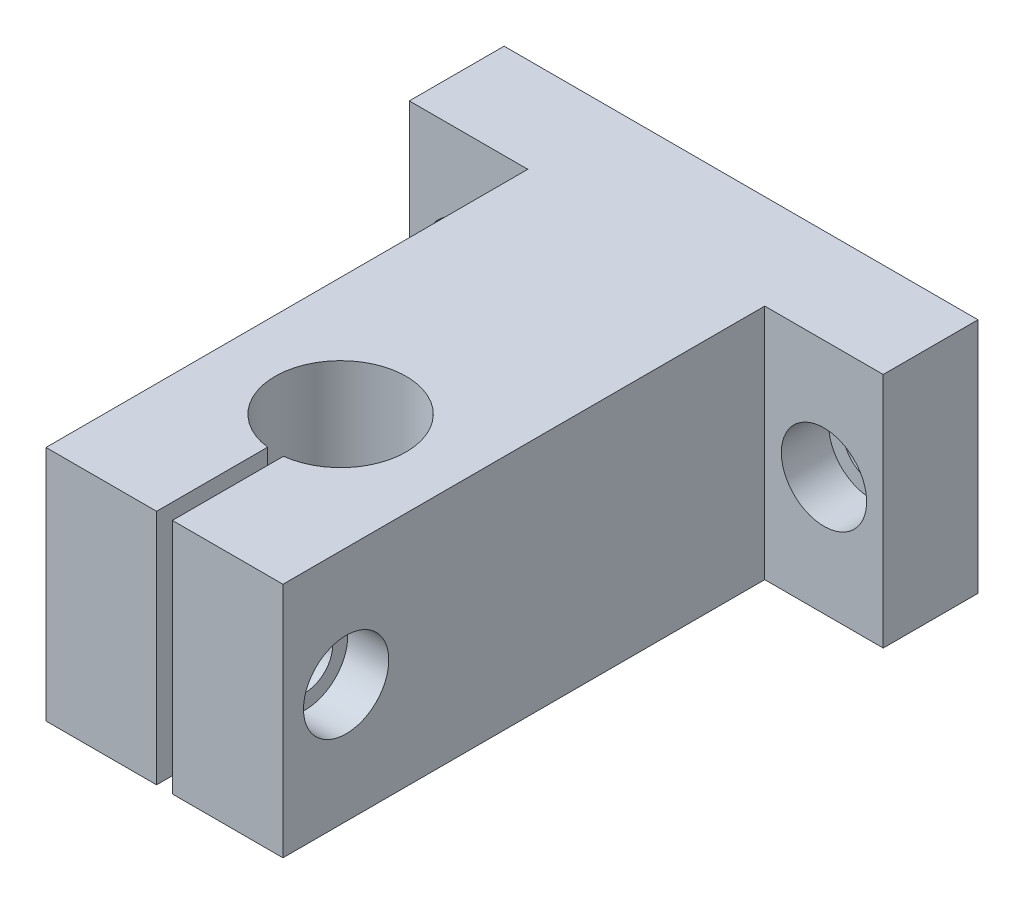
ISO-10303-21;
HEADER;
FILE_DESCRIPTION(('STEP AP214'),'2;1');
FILE_NAME('part.step','',(''),(''),'','','');
FILE_SCHEMA(('AUTOMOTIVE_DESIGN { 1 0 10303 214 1 1 1 1 }'));
ENDSEC;
DATA;
#1=APPLICATION_CONTEXT('core data for automotive mechanical design processes');
#2=APPLICATION_PROTOCOL_DEFINITION('international standard','automotive_design',2000,#1);
#3=PRODUCT_CONTEXT('',#1,'mechanical');
#4=PRODUCT('Part','Part','',(#3));
#5=PRODUCT_RELATED_PRODUCT_CATEGORY('part','',(#4));
#6=PRODUCT_DEFINITION_FORMATION('','',#4);
#7=PRODUCT_DEFINITION_CONTEXT('part definition',#1,'design');
#8=PRODUCT_DEFINITION('design','',#6,#7);
#9=PRODUCT_DEFINITION_SHAPE('','',#8);
#10=(LENGTH_UNIT() NAMED_UNIT(*) SI_UNIT(.MILLI.,.METRE.));
#11=(NAMED_UNIT(*) PLANE_ANGLE_UNIT() SI_UNIT($,.RADIAN.));
#12=(NAMED_UNIT(*) SI_UNIT($,.STERADIAN.) SOLID_ANGLE_UNIT());
#13=UNCERTAINTY_MEASURE_WITH_UNIT(LENGTH_MEASURE(1.E-05),#10,'distance_accuracy_value','');
#14=(GEOMETRIC_REPRESENTATION_CONTEXT(3) GLOBAL_UNCERTAINTY_ASSIGNED_CONTEXT((#13)) GLOBAL_UNIT_ASSIGNED_CONTEXT((#10,
#11,#12)) REPRESENTATION_CONTEXT('',''));
#15=CARTESIAN_POINT('',(0.,0.,0.));
#16=DIRECTION('',(0.,0.,1.));
#17=DIRECTION('',(1.,0.,0.));
#18=AXIS2_PLACEMENT_3D('',#15,#16,#17);
#19=CARTESIAN_POINT('',(11.25,-7.5,-60.0964096844655));
#20=DIRECTION('',(0.,0.,1.));
#21=DIRECTION('',(0.,-1.,0.));
#22=AXIS2_PLACEMENT_3D('',#19,#20,#21);
#23=CYLINDRICAL_SURFACE('',#22,1.75);
#24=CARTESIAN_POINT('',(11.25,-7.5,-16.));
#25=DIRECTION('',(0.,0.,1.));
#26=DIRECTION('',(0.,-1.,0.));
#27=AXIS2_PLACEMENT_3D('',#24,#25,#26);
#28=CIRCLE('',#27,1.75);
#29=CARTESIAN_POINT('',(11.25,-9.25,-16.));
#30=VERTEX_POINT('',#29);
#31=EDGE_CURVE('E280',#30,#30,#28,.F.);
#32=ORIENTED_EDGE('',*,*,#31,.T.);
#33=EDGE_LOOP('',(#32));
#34=FACE_BOUND('',#33,.T.);
#35=CARTESIAN_POINT('',(11.25,-7.5,-13.));
#36=DIRECTION('',(0.,0.,1.));
#37=DIRECTION('',(-1.,0.,0.));
#38=AXIS2_PLACEMENT_3D('',#35,#36,#37);
#39=CIRCLE('',#38,1.75);
#40=CARTESIAN_POINT('',(9.5,-7.5,-13.));
#41=VERTEX_POINT('',#40);
#42=EDGE_CURVE('E695',#41,#41,#39,.T.);
#43=ORIENTED_EDGE('',*,*,#42,.T.);
#44=EDGE_LOOP('',(#43));
#45=FACE_BOUND('',#44,.T.);
#46=ADVANCED_FACE('F16',(#34,#45),#23,.F.);
#47=CARTESIAN_POINT('',(-7.5,-15.,-1.09983721300845));
#48=DIRECTION('',(1.,0.,0.));
#49=DIRECTION('',(0.,1.,0.));
#50=AXIS2_PLACEMENT_3D('',#47,#48,#49);
#51=PLANE('',#50);
#52=DIRECTION('',(0.,0.,-1.));
#53=VECTOR('',#52,1.);
#54=CARTESIAN_POINT('',(-7.5,0.,-1.09983721300845));
#55=LINE('',#54,#53);
#56=CARTESIAN_POINT('',(-7.5,0.,20.5));
#57=VERTEX_POINT('',#56);
#58=CARTESIAN_POINT('',(-7.5,0.,-10.));
#59=VERTEX_POINT('',#58);
#60=EDGE_CURVE('E343',#57,#59,#55,.T.);
#61=ORIENTED_EDGE('',*,*,#60,.T.);
#62=DIRECTION('',(0.,1.,0.));
#63=VECTOR('',#62,1.);
#64=CARTESIAN_POINT('',(-7.5,-15.,-10.));
#65=LINE('',#64,#63);
#66=CARTESIAN_POINT('',(-7.5,-15.,-10.));
#67=VERTEX_POINT('',#66);
#68=EDGE_CURVE('E26',#67,#59,#65,.T.);
#69=ORIENTED_EDGE('',*,*,#68,.F.);
#70=DIRECTION('',(0.,0.,-1.));
#71=VECTOR('',#70,1.);
#72=CARTESIAN_POINT('',(-7.5,-15.,-1.09983721300845));
#73=LINE('',#72,#71);
#74=CARTESIAN_POINT('',(-7.5,-15.,20.5));
#75=VERTEX_POINT('',#74);
#76=EDGE_CURVE('E308',#75,#67,#73,.T.);
#77=ORIENTED_EDGE('',*,*,#76,.F.);
#78=DIRECTION('',(0.,1.,0.));
#79=VECTOR('',#78,1.);
#80=CARTESIAN_POINT('',(-7.5,-15.,20.5));
#81=LINE('',#80,#79);
#82=EDGE_CURVE('E10',#75,#57,#81,.T.);
#83=ORIENTED_EDGE('',*,*,#82,.T.);
#84=EDGE_LOOP('',(#61,#69,#77,#83));
#85=FACE_BOUND('',#84,.T.);
#86=DIRECTION('',(0.,-0.77557066614127,-0.631260755806336));
#87=VECTOR('',#86,1.);
#88=CARTESIAN_POINT('',(-7.5,-9.26753011625774,18.6715978651955));
#89=LINE('',#88,#87);
#90=CARTESIAN_POINT('',(-7.5,-8.01375750421547,19.6920818536178));
#91=VERTEX_POINT('',#90);
#92=CARTESIAN_POINT('',(-7.5,-10.5213027283,17.6511138767734));
#93=VERTEX_POINT('',#92);
#94=EDGE_CURVE('E193',#91,#93,#89,.T.);
#95=ORIENTED_EDGE('',*,*,#94,.T.);
#96=DIRECTION('',(0.,0.158902517869817,-0.987294277211528));
#97=VECTOR('',#96,1.);
#98=CARTESIAN_POINT('',(-7.5,-8.61714673765487,5.82019805691087));
#99=LINE('',#98,#97);
#100=CARTESIAN_POINT('',(-7.5,-10.0075452240845,14.4590320231556));
#101=VERTEX_POINT('',#100);
#102=EDGE_CURVE('E216',#93,#101,#99,.T.);
#103=ORIENTED_EDGE('',*,*,#102,.T.);
#104=DIRECTION('',(0.,0.934473184011087,-0.356033521405191));
#105=VECTOR('',#104,1.);
#106=CARTESIAN_POINT('',(-7.5,-8.49689385993454,13.883475084769));
#107=LINE('',#106,#105);
#108=CARTESIAN_POINT('',(-7.5,-6.98624249578453,13.3079181463823));
#109=VERTEX_POINT('',#108);
#110=EDGE_CURVE('E39',#101,#109,#107,.T.);
#111=ORIENTED_EDGE('',*,*,#110,.T.);
#112=DIRECTION('',(0.,0.77557066614127,0.631260755806336));
#113=VECTOR('',#112,1.);
#114=CARTESIAN_POINT('',(-7.5,-10.8731367950827,10.144255645682));
#115=LINE('',#114,#113);
#116=CARTESIAN_POINT('',(-7.5,-4.47869727169999,15.3488861232267));
#117=VERTEX_POINT('',#116);
#118=EDGE_CURVE('E252',#109,#117,#115,.T.);
#119=ORIENTED_EDGE('',*,*,#118,.T.);
#120=DIRECTION('',(0.,-0.158902517869817,0.987294277211528));
#121=VECTOR('',#120,1.);
#122=CARTESIAN_POINT('',(-7.5,-3.08829878527031,6.71005215698185));
#123=LINE('',#122,#121);
#124=CARTESIAN_POINT('',(-7.5,-4.99245477591546,18.5409679768443));
#125=VERTEX_POINT('',#124);
#126=EDGE_CURVE('E248',#117,#125,#123,.T.);
#127=ORIENTED_EDGE('',*,*,#126,.T.);
#128=DIRECTION('',(0.,-0.934473184011087,0.356033521405191));
#129=VECTOR('',#128,1.);
#130=CARTESIAN_POINT('',(-7.5,-6.50310614006546,19.1165249152311));
#131=LINE('',#130,#129);
#132=EDGE_CURVE('E244',#125,#91,#131,.T.);
#133=ORIENTED_EDGE('',*,*,#132,.T.);
#134=EDGE_LOOP('',(#95,#103,#111,#119,#127,#133));
#135=FACE_BOUND('',#134,.T.);
#136=ADVANCED_FACE('F426',(#85,#135),#51,.F.);
#137=CARTESIAN_POINT('',(-42.0806566428164,-7.5,16.5));
#138=DIRECTION('',(1.,0.,0.));
#139=DIRECTION('',(0.,1.,0.));
#140=AXIS2_PLACEMENT_3D('',#137,#138,#139);
#141=CYLINDRICAL_SURFACE('',#140,1.75);
#142=CARTESIAN_POINT('',(-0.5,-7.5,16.5));
#143=DIRECTION('',(-1.,0.,0.));
#144=DIRECTION('',(0.,-1.,0.));
#145=AXIS2_PLACEMENT_3D('',#142,#143,#144);
#146=CIRCLE('',#145,1.75);
#147=CARTESIAN_POINT('',(-0.5,-9.25,16.5));
#148=VERTEX_POINT('',#147);
#149=EDGE_CURVE('E20',#148,#148,#146,.T.);
#150=ORIENTED_EDGE('',*,*,#149,.F.);
#151=EDGE_LOOP('',(#150));
#152=FACE_BOUND('',#151,.T.);
#153=CARTESIAN_POINT('',(-5.,-7.5,16.5));
#154=DIRECTION('',(1.,0.,0.));
#155=DIRECTION('',(0.,1.,0.));
#156=AXIS2_PLACEMENT_3D('',#153,#154,#155);
#157=CIRCLE('',#156,1.75);
#158=CARTESIAN_POINT('',(-5.,-5.75,16.5));
#159=VERTEX_POINT('',#158);
#160=EDGE_CURVE('E239',#159,#159,#157,.T.);
#161=ORIENTED_EDGE('',*,*,#160,.F.);
#162=EDGE_LOOP('',(#161));
#163=FACE_BOUND('',#162,.T.);
#164=ADVANCED_FACE('F419',(#152,#163),#141,.F.);
#165=CARTESIAN_POINT('',(0.010133573450063,-15.,20.5));
#166=DIRECTION('',(0.,0.,1.));
#167=DIRECTION('',(0.,-1.,0.));
#168=AXIS2_PLACEMENT_3D('',#165,#166,#167);
#169=PLANE('',#168);
#170=DIRECTION('',(1.,0.,0.));
#171=VECTOR('',#170,1.);
#172=CARTESIAN_POINT('',(0.010133573450063,0.,20.5));
#173=LINE('',#172,#171);
#174=CARTESIAN_POINT('',(0.5,0.,20.5));
#175=VERTEX_POINT('',#174);
#176=CARTESIAN_POINT('',(7.5,0.,20.5));
#177=VERTEX_POINT('',#176);
#178=EDGE_CURVE('E303',#175,#177,#173,.T.);
#179=ORIENTED_EDGE('',*,*,#178,.F.);
#180=DIRECTION('',(0.,-1.,0.));
#181=VECTOR('',#180,1.);
#182=CARTESIAN_POINT('',(0.5,-7.5,20.5));
#183=LINE('',#182,#181);
#184=CARTESIAN_POINT('',(0.5,-15.,20.5));
#185=VERTEX_POINT('',#184);
#186=EDGE_CURVE('E279',#175,#185,#183,.T.);
#187=ORIENTED_EDGE('',*,*,#186,.T.);
#188=DIRECTION('',(1.,0.,0.));
#189=VECTOR('',#188,1.);
#190=CARTESIAN_POINT('',(0.010133573450063,-15.,20.5));
#191=LINE('',#190,#189);
#192=CARTESIAN_POINT('',(7.5,-15.,20.5));
#193=VERTEX_POINT('',#192);
#194=EDGE_CURVE('E309',#185,#193,#191,.T.);
#195=ORIENTED_EDGE('',*,*,#194,.T.);
#196=DIRECTION('',(0.,1.,0.));
#197=VECTOR('',#196,1.);
#198=CARTESIAN_POINT('',(7.5,-15.,20.5));
#199=LINE('',#198,#197);
#200=EDGE_CURVE('E338',#193,#177,#199,.T.);
#201=ORIENTED_EDGE('',*,*,#200,.T.);
#202=EDGE_LOOP('',(#179,#187,#195,#201));
#203=FACE_BOUND('',#202,.T.);
#204=ADVANCED_FACE('F440',(#203),#169,.T.);
#205=CARTESIAN_POINT('',(0.,-15.,2.25));
#206=DIRECTION('',(0.,-1.,0.));
#207=DIRECTION('',(1.,0.,0.));
#208=AXIS2_PLACEMENT_3D('',#205,#206,#207);
#209=PLANE('',#208);
#210=CARTESIAN_POINT('',(0.,-15.,9.35));
#211=DIRECTION('',(0.,-1.,0.));
#212=DIRECTION('',(1.,0.,0.));
#213=AXIS2_PLACEMENT_3D('',#210,#211,#212);
#214=CIRCLE('',#213,4.15);
#215=CARTESIAN_POINT('',(-0.5,-15.,13.4697694110229));
#216=VERTEX_POINT('',#215);
#217=CARTESIAN_POINT('',(0.5,-15.,13.4697694110229));
#218=VERTEX_POINT('',#217);
#219=EDGE_CURVE('E334',#216,#218,#214,.T.);
#220=ORIENTED_EDGE('',*,*,#219,.F.);
#221=DIRECTION('',(0.,0.,1.));
#222=VECTOR('',#221,1.);
#223=CARTESIAN_POINT('',(-0.5,-15.,10.5));
#224=LINE('',#223,#222);
#225=CARTESIAN_POINT('',(-0.5,-15.,20.5));
#226=VERTEX_POINT('',#225);
#227=EDGE_CURVE('E51',#216,#226,#224,.T.);
#228=ORIENTED_EDGE('',*,*,#227,.T.);
#229=EDGE_CURVE('E304',#75,#226,#191,.T.);
#230=ORIENTED_EDGE('',*,*,#229,.F.);
#231=ORIENTED_EDGE('',*,*,#76,.T.);
#232=DIRECTION('',(1.,0.,0.));
#233=VECTOR('',#232,1.);
#234=CARTESIAN_POINT('',(-12.2312085309041,-15.,-10.));
#235=LINE('',#234,#233);
#236=CARTESIAN_POINT('',(-15.,-15.,-10.));
#237=VERTEX_POINT('',#236);
#238=EDGE_CURVE('E312',#237,#67,#235,.T.);
#239=ORIENTED_EDGE('',*,*,#238,.F.);
#240=DIRECTION('',(0.,0.,-1.));
#241=VECTOR('',#240,1.);
#242=CARTESIAN_POINT('',(-15.,-15.,-12.9314772319689));
#243=LINE('',#242,#241);
#244=CARTESIAN_POINT('',(-15.,-15.,-16.));
#245=VERTEX_POINT('',#244);
#246=EDGE_CURVE('E316',#237,#245,#243,.T.);
#247=ORIENTED_EDGE('',*,*,#246,.T.);
#248=DIRECTION('',(1.,0.,0.));
#249=VECTOR('',#248,1.);
#250=CARTESIAN_POINT('',(-0.192547598475021,-15.,-16.));
#251=LINE('',#250,#249);
#252=CARTESIAN_POINT('',(15.,-15.,-16.));
#253=VERTEX_POINT('',#252);
#254=EDGE_CURVE('E319',#245,#253,#251,.T.);
#255=ORIENTED_EDGE('',*,*,#254,.T.);
#256=DIRECTION('',(0.,0.,-1.));
#257=VECTOR('',#256,1.);
#258=CARTESIAN_POINT('',(15.,-15.,-16.7781049479399));
#259=LINE('',#258,#257);
#260=CARTESIAN_POINT('',(15.,-15.,-10.));
#261=VERTEX_POINT('',#260);
#262=EDGE_CURVE('E322',#261,#253,#259,.T.);
#263=ORIENTED_EDGE('',*,*,#262,.F.);
#264=DIRECTION('',(1.,0.,0.));
#265=VECTOR('',#264,1.);
#266=CARTESIAN_POINT('',(11.9481068629648,-15.,-10.));
#267=LINE('',#266,#265);
#268=CARTESIAN_POINT('',(7.5,-15.,-10.));
#269=VERTEX_POINT('',#268);
#270=EDGE_CURVE('E326',#269,#261,#267,.T.);
#271=ORIENTED_EDGE('',*,*,#270,.F.);
#272=DIRECTION('',(0.,0.,-1.));
#273=VECTOR('',#272,1.);
#274=CARTESIAN_POINT('',(7.5,-15.,-1.10016278699155));
#275=LINE('',#274,#273);
#276=EDGE_CURVE('E330',#193,#269,#275,.T.);
#277=ORIENTED_EDGE('',*,*,#276,.F.);
#278=ORIENTED_EDGE('',*,*,#194,.F.);
#279=DIRECTION('',(0.,0.,1.));
#280=VECTOR('',#279,1.);
#281=CARTESIAN_POINT('',(0.5,-15.,10.5));
#282=LINE('',#281,#280);
#283=EDGE_CURVE('E288',#218,#185,#282,.T.);
#284=ORIENTED_EDGE('',*,*,#283,.F.);
#285=EDGE_LOOP('',(#220,#228,#230,#231,#239,#247,#255,#263,#271,#277,#278,#284));
#286=FACE_BOUND('',#285,.T.);
#287=ADVANCED_FACE('F437',(#286),#209,.T.);
#288=DIRECTION('',(0.,-1.,0.));
#289=VECTOR('',#288,1.);
#290=CARTESIAN_POINT('',(-0.5,-7.5,20.5));
#291=LINE('',#290,#289);
#292=CARTESIAN_POINT('',(-0.5,0.,20.5));
#293=VERTEX_POINT('',#292);
#294=EDGE_CURVE('E276',#293,#226,#291,.T.);
#295=ORIENTED_EDGE('',*,*,#294,.F.);
#296=EDGE_CURVE('E339',#57,#293,#173,.T.);
#297=ORIENTED_EDGE('',*,*,#296,.F.);
#298=ORIENTED_EDGE('',*,*,#82,.F.);
#299=ORIENTED_EDGE('',*,*,#229,.T.);
#300=EDGE_LOOP('',(#295,#297,#298,#299));
#301=FACE_BOUND('',#300,.T.);
#302=ADVANCED_FACE('F18',(#301),#169,.T.);
#303=CARTESIAN_POINT('',(-12.2312085309041,-15.,-10.));
#304=DIRECTION('',(0.,0.,1.));
#305=DIRECTION('',(0.,-1.,0.));
#306=AXIS2_PLACEMENT_3D('',#303,#304,#305);
#307=PLANE('',#306);
#308=CARTESIAN_POINT('',(-11.25,-7.5,-10.));
#309=DIRECTION('',(0.,0.,1.));
#310=DIRECTION('',(-1.,0.,0.));
#311=AXIS2_PLACEMENT_3D('',#308,#309,#310);
#312=CIRCLE('',#311,2.7);
#313=CARTESIAN_POINT('',(-13.95,-7.5,-10.));
#314=VERTEX_POINT('',#313);
#315=EDGE_CURVE('E477',#314,#314,#312,.T.);
#316=ORIENTED_EDGE('',*,*,#315,.F.);
#317=EDGE_LOOP('',(#316));
#318=FACE_BOUND('',#317,.T.);
#319=DIRECTION('',(1.,0.,0.));
#320=VECTOR('',#319,1.);
#321=CARTESIAN_POINT('',(-12.2312085309041,0.,-10.));
#322=LINE('',#321,#320);
#323=CARTESIAN_POINT('',(-15.,0.,-10.));
#324=VERTEX_POINT('',#323);
#325=EDGE_CURVE('E347',#324,#59,#322,.T.);
#326=ORIENTED_EDGE('',*,*,#325,.F.);
#327=DIRECTION('',(0.,1.,0.));
#328=VECTOR('',#327,1.);
#329=CARTESIAN_POINT('',(-15.,-15.,-10.));
#330=LINE('',#329,#328);
#331=EDGE_CURVE('E390',#237,#324,#330,.T.);
#332=ORIENTED_EDGE('',*,*,#331,.F.);
#333=ORIENTED_EDGE('',*,*,#238,.T.);
#334=ORIENTED_EDGE('',*,*,#68,.T.);
#335=EDGE_LOOP('',(#326,#332,#333,#334));
#336=FACE_BOUND('',#335,.T.);
#337=ADVANCED_FACE('F466',(#318,#336),#307,.T.);
#338=CARTESIAN_POINT('',(-15.,-15.,-12.9314772319689));
#339=DIRECTION('',(1.,0.,0.));
#340=DIRECTION('',(0.,1.,0.));
#341=AXIS2_PLACEMENT_3D('',#338,#339,#340);
#342=PLANE('',#341);
#343=DIRECTION('',(0.,0.,-1.));
#344=VECTOR('',#343,1.);
#345=CARTESIAN_POINT('',(-15.,0.,-12.9314772319689));
#346=LINE('',#345,#344);
#347=CARTESIAN_POINT('',(-15.,0.,-16.));
#348=VERTEX_POINT('',#347);
#349=EDGE_CURVE('E351',#324,#348,#346,.T.);
#350=ORIENTED_EDGE('',*,*,#349,.T.);
#351=DIRECTION('',(0.,1.,0.));
#352=VECTOR('',#351,1.);
#353=CARTESIAN_POINT('',(-15.,-15.,-16.));
#354=LINE('',#353,#352);
#355=EDGE_CURVE('E386',#245,#348,#354,.T.);
#356=ORIENTED_EDGE('',*,*,#355,.F.);
#357=ORIENTED_EDGE('',*,*,#246,.F.);
#358=ORIENTED_EDGE('',*,*,#331,.T.);
#359=EDGE_LOOP('',(#350,#356,#357,#358));
#360=FACE_BOUND('',#359,.T.);
#361=ADVANCED_FACE('F463',(#360),#342,.F.);
#362=CARTESIAN_POINT('',(-0.192547598475021,-15.,-16.));
#363=DIRECTION('',(0.,0.,1.));
#364=DIRECTION('',(0.,-1.,0.));
#365=AXIS2_PLACEMENT_3D('',#362,#363,#364);
#366=PLANE('',#365);
#367=CARTESIAN_POINT('',(-11.25,-7.5,-16.));
#368=DIRECTION('',(0.,0.,1.));
#369=DIRECTION('',(0.,-1.,0.));
#370=AXIS2_PLACEMENT_3D('',#367,#368,#369);
#371=CIRCLE('',#370,1.75);
#372=CARTESIAN_POINT('',(-11.25,-9.25,-16.));
#373=VERTEX_POINT('',#372);
#374=EDGE_CURVE('E275',#373,#373,#371,.T.);
#375=ORIENTED_EDGE('',*,*,#374,.T.);
#376=EDGE_LOOP('',(#375));
#377=FACE_BOUND('',#376,.T.);
#378=ORIENTED_EDGE('',*,*,#31,.F.);
#379=EDGE_LOOP('',(#378));
#380=FACE_BOUND('',#379,.T.);
#381=DIRECTION('',(1.,0.,0.));
#382=VECTOR('',#381,1.);
#383=CARTESIAN_POINT('',(-0.192547598475021,0.,-16.));
#384=LINE('',#383,#382);
#385=CARTESIAN_POINT('',(15.,0.,-16.));
#386=VERTEX_POINT('',#385);
#387=EDGE_CURVE('E354',#348,#386,#384,.T.);
#388=ORIENTED_EDGE('',*,*,#387,.T.);
#389=DIRECTION('',(0.,1.,0.));
#390=VECTOR('',#389,1.);
#391=CARTESIAN_POINT('',(15.,-15.,-16.));
#392=LINE('',#391,#390);
#393=EDGE_CURVE('E383',#253,#386,#392,.T.);
#394=ORIENTED_EDGE('',*,*,#393,.F.);
#395=ORIENTED_EDGE('',*,*,#254,.F.);
#396=ORIENTED_EDGE('',*,*,#355,.T.);
#397=EDGE_LOOP('',(#388,#394,#395,#396));
#398=FACE_BOUND('',#397,.T.);
#399=ADVANCED_FACE('F404',(#377,#380,#398),#366,.F.);
#400=CARTESIAN_POINT('',(15.,-15.,-16.7781049479399));
#401=DIRECTION('',(1.,0.,0.));
#402=DIRECTION('',(0.,1.,0.));
#403=AXIS2_PLACEMENT_3D('',#400,#401,#402);
#404=PLANE('',#403);
#405=DIRECTION('',(0.,0.,-1.));
#406=VECTOR('',#405,1.);
#407=CARTESIAN_POINT('',(15.,0.,-16.7781049479399));
#408=LINE('',#407,#406);
#409=CARTESIAN_POINT('',(15.,0.,-10.));
#410=VERTEX_POINT('',#409);
#411=EDGE_CURVE('E358',#410,#386,#408,.T.);
#412=ORIENTED_EDGE('',*,*,#411,.F.);
#413=DIRECTION('',(0.,1.,0.));
#414=VECTOR('',#413,1.);
#415=CARTESIAN_POINT('',(15.,-15.,-10.));
#416=LINE('',#415,#414);
#417=EDGE_CURVE('E380',#261,#410,#416,.T.);
#418=ORIENTED_EDGE('',*,*,#417,.F.);
#419=ORIENTED_EDGE('',*,*,#262,.T.);
#420=ORIENTED_EDGE('',*,*,#393,.T.);
#421=EDGE_LOOP('',(#412,#418,#419,#420));
#422=FACE_BOUND('',#421,.T.);
#423=ADVANCED_FACE('F456',(#422),#404,.T.);
#424=CARTESIAN_POINT('',(11.9481068629648,-15.,-10.));
#425=DIRECTION('',(0.,0.,1.));
#426=DIRECTION('',(0.,-1.,0.));
#427=AXIS2_PLACEMENT_3D('',#424,#425,#426);
#428=PLANE('',#427);
#429=CARTESIAN_POINT('',(11.25,-7.5,-10.));
#430=DIRECTION('',(0.,0.,1.));
#431=DIRECTION('',(-1.,0.,0.));
#432=AXIS2_PLACEMENT_3D('',#429,#430,#431);
#433=CIRCLE('',#432,2.7);
#434=CARTESIAN_POINT('',(8.55,-7.5,-10.));
#435=VERTEX_POINT('',#434);
#436=EDGE_CURVE('E704',#435,#435,#433,.T.);
#437=ORIENTED_EDGE('',*,*,#436,.F.);
#438=EDGE_LOOP('',(#437));
#439=FACE_BOUND('',#438,.T.);
#440=DIRECTION('',(1.,0.,0.));
#441=VECTOR('',#440,1.);
#442=CARTESIAN_POINT('',(11.9481068629648,0.,-10.));
#443=LINE('',#442,#441);
#444=CARTESIAN_POINT('',(7.5,0.,-10.));
#445=VERTEX_POINT('',#444);
#446=EDGE_CURVE('E362',#445,#410,#443,.T.);
#447=ORIENTED_EDGE('',*,*,#446,.F.);
#448=DIRECTION('',(0.,1.,0.));
#449=VECTOR('',#448,1.);
#450=CARTESIAN_POINT('',(7.5,-15.,-10.));
#451=LINE('',#450,#449);
#452=EDGE_CURVE('E377',#269,#445,#451,.T.);
#453=ORIENTED_EDGE('',*,*,#452,.F.);
#454=ORIENTED_EDGE('',*,*,#270,.T.);
#455=ORIENTED_EDGE('',*,*,#417,.T.);
#456=EDGE_LOOP('',(#447,#453,#454,#455));
#457=FACE_BOUND('',#456,.T.);
#458=ADVANCED_FACE('F452',(#439,#457),#428,.T.);
#459=CARTESIAN_POINT('',(7.5,-15.,-1.10016278699155));
#460=DIRECTION('',(1.,0.,0.));
#461=DIRECTION('',(0.,1.,0.));
#462=AXIS2_PLACEMENT_3D('',#459,#460,#461);
#463=PLANE('',#462);
#464=CARTESIAN_POINT('',(7.5,-7.5,16.5));
#465=DIRECTION('',(1.,0.,0.));
#466=DIRECTION('',(0.,0.,1.));
#467=AXIS2_PLACEMENT_3D('',#464,#465,#466);
#468=CIRCLE('',#467,2.7);
#469=CARTESIAN_POINT('',(7.5,-7.5,19.2));
#470=VERTEX_POINT('',#469);
#471=EDGE_CURVE('E225',#470,#470,#468,.T.);
#472=ORIENTED_EDGE('',*,*,#471,.F.);
#473=EDGE_LOOP('',(#472));
#474=FACE_BOUND('',#473,.T.);
#475=DIRECTION('',(0.,0.,-1.));
#476=VECTOR('',#475,1.);
#477=CARTESIAN_POINT('',(7.5,0.,-1.10016278699155));
#478=LINE('',#477,#476);
#479=EDGE_CURVE('E366',#177,#445,#478,.T.);
#480=ORIENTED_EDGE('',*,*,#479,.F.);
#481=ORIENTED_EDGE('',*,*,#200,.F.);
#482=ORIENTED_EDGE('',*,*,#276,.T.);
#483=ORIENTED_EDGE('',*,*,#452,.T.);
#484=EDGE_LOOP('',(#480,#481,#482,#483));
#485=FACE_BOUND('',#484,.T.);
#486=ADVANCED_FACE('F448',(#474,#485),#463,.T.);
#487=CARTESIAN_POINT('',(0.,-15.,9.35));
#488=DIRECTION('',(0.,1.,0.));
#489=DIRECTION('',(-1.,0.,0.));
#490=AXIS2_PLACEMENT_3D('',#487,#488,#489);
#491=CYLINDRICAL_SURFACE('',#490,4.15);
#492=DIRECTION('',(0.,1.,0.));
#493=VECTOR('',#492,1.);
#494=CARTESIAN_POINT('',(-0.5,-15.,13.4697694110229));
#495=LINE('',#494,#493);
#496=CARTESIAN_POINT('',(-0.5,0.,13.4697694110229));
#497=VERTEX_POINT('',#496);
#498=EDGE_CURVE('E300',#216,#497,#495,.T.);
#499=ORIENTED_EDGE('',*,*,#498,.F.);
#500=ORIENTED_EDGE('',*,*,#219,.T.);
#501=DIRECTION('',(0.,1.,0.));
#502=VECTOR('',#501,1.);
#503=CARTESIAN_POINT('',(0.5,-15.,13.4697694110229));
#504=LINE('',#503,#502);
#505=CARTESIAN_POINT('',(0.5,0.,13.4697694110229));
#506=VERTEX_POINT('',#505);
#507=EDGE_CURVE('E296',#218,#506,#504,.T.);
#508=ORIENTED_EDGE('',*,*,#507,.T.);
#509=CARTESIAN_POINT('',(0.,0.,9.35));
#510=DIRECTION('',(0.,-1.,0.));
#511=DIRECTION('',(1.,0.,0.));
#512=AXIS2_PLACEMENT_3D('',#509,#510,#511);
#513=CIRCLE('',#512,4.15);
#514=EDGE_CURVE('E370',#497,#506,#513,.T.);
#515=ORIENTED_EDGE('',*,*,#514,.F.);
#516=EDGE_LOOP('',(#499,#500,#508,#515));
#517=FACE_BOUND('',#516,.T.);
#518=ADVANCED_FACE('F444',(#517),#491,.F.);
#519=CARTESIAN_POINT('',(0.,0.,2.25));
#520=DIRECTION('',(0.,-1.,0.));
#521=DIRECTION('',(1.,0.,0.));
#522=AXIS2_PLACEMENT_3D('',#519,#520,#521);
#523=PLANE('',#522);
#524=ORIENTED_EDGE('',*,*,#514,.T.);
#525=DIRECTION('',(0.,0.,1.));
#526=VECTOR('',#525,1.);
#527=CARTESIAN_POINT('',(0.5,0.,10.5));
#528=LINE('',#527,#526);
#529=EDGE_CURVE('E284',#506,#175,#528,.T.);
#530=ORIENTED_EDGE('',*,*,#529,.T.);
#531=ORIENTED_EDGE('',*,*,#178,.T.);
#532=ORIENTED_EDGE('',*,*,#479,.T.);
#533=ORIENTED_EDGE('',*,*,#446,.T.);
#534=ORIENTED_EDGE('',*,*,#411,.T.);
#535=ORIENTED_EDGE('',*,*,#387,.F.);
#536=ORIENTED_EDGE('',*,*,#349,.F.);
#537=ORIENTED_EDGE('',*,*,#325,.T.);
#538=ORIENTED_EDGE('',*,*,#60,.F.);
#539=ORIENTED_EDGE('',*,*,#296,.T.);
#540=DIRECTION('',(0.,0.,1.));
#541=VECTOR('',#540,1.);
#542=CARTESIAN_POINT('',(-0.5,0.,10.5));
#543=LINE('',#542,#541);
#544=EDGE_CURVE('E293',#497,#293,#543,.T.);
#545=ORIENTED_EDGE('',*,*,#544,.F.);
#546=EDGE_LOOP('',(#524,#530,#531,#532,#533,#534,#535,#536,#537,#538,#539,#545));
#547=FACE_BOUND('',#546,.T.);
#548=ADVANCED_FACE('F434',(#547),#523,.F.);
#549=CARTESIAN_POINT('',(0.5,-7.5,10.5));
#550=DIRECTION('',(-1.,0.,0.));
#551=DIRECTION('',(0.,-1.,0.));
#552=AXIS2_PLACEMENT_3D('',#549,#550,#551);
#553=PLANE('',#552);
#554=CARTESIAN_POINT('',(0.5,-7.5,16.5));
#555=DIRECTION('',(-1.,0.,0.));
#556=DIRECTION('',(0.,-1.,0.));
#557=AXIS2_PLACEMENT_3D('',#554,#555,#556);
#558=CIRCLE('',#557,1.75);
#559=CARTESIAN_POINT('',(0.5,-9.25,16.5));
#560=VERTEX_POINT('',#559);
#561=EDGE_CURVE('E271',#560,#560,#558,.T.);
#562=ORIENTED_EDGE('',*,*,#561,.F.);
#563=EDGE_LOOP('',(#562));
#564=FACE_BOUND('',#563,.T.);
#565=ORIENTED_EDGE('',*,*,#283,.T.);
#566=ORIENTED_EDGE('',*,*,#186,.F.);
#567=ORIENTED_EDGE('',*,*,#529,.F.);
#568=ORIENTED_EDGE('',*,*,#507,.F.);
#569=EDGE_LOOP('',(#565,#566,#567,#568));
#570=FACE_BOUND('',#569,.T.);
#571=ADVANCED_FACE('F420',(#564,#570),#553,.T.);
#572=CARTESIAN_POINT('',(-0.5,-7.5,10.5));
#573=DIRECTION('',(-1.,0.,0.));
#574=DIRECTION('',(0.,-1.,0.));
#575=AXIS2_PLACEMENT_3D('',#572,#573,#574);
#576=PLANE('',#575);
#577=ORIENTED_EDGE('',*,*,#149,.T.);
#578=EDGE_LOOP('',(#577));
#579=FACE_BOUND('',#578,.T.);
#580=ORIENTED_EDGE('',*,*,#498,.T.);
#581=ORIENTED_EDGE('',*,*,#544,.T.);
#582=ORIENTED_EDGE('',*,*,#294,.T.);
#583=ORIENTED_EDGE('',*,*,#227,.F.);
#584=EDGE_LOOP('',(#580,#581,#582,#583));
#585=FACE_BOUND('',#584,.T.);
#586=ADVANCED_FACE('F410',(#579,#585),#576,.F.);
#587=CARTESIAN_POINT('',(-11.25,-7.5,-35.));
#588=DIRECTION('',(0.,0.,1.));
#589=DIRECTION('',(0.,-1.,0.));
#590=AXIS2_PLACEMENT_3D('',#587,#588,#589);
#591=CYLINDRICAL_SURFACE('',#590,1.75);
#592=CARTESIAN_POINT('',(-11.25,-7.5,-13.));
#593=DIRECTION('',(0.,0.,1.));
#594=DIRECTION('',(-1.,0.,0.));
#595=AXIS2_PLACEMENT_3D('',#592,#593,#594);
#596=CIRCLE('',#595,1.75);
#597=CARTESIAN_POINT('',(-13.,-7.5,-13.));
#598=VERTEX_POINT('',#597);
#599=EDGE_CURVE('E702',#598,#598,#596,.T.);
#600=ORIENTED_EDGE('',*,*,#599,.T.);
#601=EDGE_LOOP('',(#600));
#602=FACE_BOUND('',#601,.T.);
#603=ORIENTED_EDGE('',*,*,#374,.F.);
#604=EDGE_LOOP('',(#603));
#605=FACE_BOUND('',#604,.T.);
#606=ADVANCED_FACE('F407',(#602,#605),#591,.F.);
#607=CARTESIAN_POINT('',(4.9,-7.5,16.5));
#608=DIRECTION('',(1.,0.,0.));
#609=DIRECTION('',(0.,0.,1.));
#610=AXIS2_PLACEMENT_3D('',#607,#608,#609);
#611=CIRCLE('',#610,1.75);
#612=CARTESIAN_POINT('',(4.9,-7.5,18.25));
#613=VERTEX_POINT('',#612);
#614=EDGE_CURVE('E714',#613,#613,#611,.T.);
#615=ORIENTED_EDGE('',*,*,#614,.T.);
#616=EDGE_LOOP('',(#615));
#617=FACE_BOUND('',#616,.T.);
#618=ORIENTED_EDGE('',*,*,#561,.T.);
#619=EDGE_LOOP('',(#618));
#620=FACE_BOUND('',#619,.T.);
#621=ADVANCED_FACE('F409',(#617,#620),#141,.F.);
#622=CARTESIAN_POINT('',(-5.,-9.26753011625774,18.6715978651955));
#623=DIRECTION('',(0.,0.631260755806336,-0.77557066614127));
#624=DIRECTION('',(0.,0.77557066614127,0.631260755806336));
#625=AXIS2_PLACEMENT_3D('',#622,#623,#624);
#626=PLANE('',#625);
#627=ORIENTED_EDGE('',*,*,#94,.F.);
#628=DIRECTION('',(-1.,0.,0.));
#629=VECTOR('',#628,1.);
#630=CARTESIAN_POINT('',(-5.,-8.01375750421547,19.6920818536178));
#631=LINE('',#630,#629);
#632=CARTESIAN_POINT('',(-5.,-8.01375750421547,19.6920818536178));
#633=VERTEX_POINT('',#632);
#634=EDGE_CURVE('E187',#633,#91,#631,.T.);
#635=ORIENTED_EDGE('',*,*,#634,.F.);
#636=DIRECTION('',(0.,-0.77557066614127,-0.631260755806336));
#637=VECTOR('',#636,1.);
#638=CARTESIAN_POINT('',(-5.,-9.26753011625774,18.6715978651955));
#639=LINE('',#638,#637);
#640=CARTESIAN_POINT('',(-5.,-10.5213027283,17.6511138767734));
#641=VERTEX_POINT('',#640);
#642=EDGE_CURVE('E191',#633,#641,#639,.T.);
#643=ORIENTED_EDGE('',*,*,#642,.T.);
#644=DIRECTION('',(-1.,0.,0.));
#645=VECTOR('',#644,1.);
#646=CARTESIAN_POINT('',(-5.,-10.5213027283,17.6511138767734));
#647=LINE('',#646,#645);
#648=EDGE_CURVE('E242',#641,#93,#647,.T.);
#649=ORIENTED_EDGE('',*,*,#648,.T.);
#650=EDGE_LOOP('',(#627,#635,#643,#649));
#651=FACE_BOUND('',#650,.T.);
#652=ADVANCED_FACE('F189',(#651),#626,.T.);
#653=CARTESIAN_POINT('',(-5.,-6.50310614006546,19.1165249152311));
#654=DIRECTION('',(0.,-0.356033521405191,-0.934473184011087));
#655=DIRECTION('',(0.,0.934473184011087,-0.356033521405191));
#656=AXIS2_PLACEMENT_3D('',#653,#654,#655);
#657=PLANE('',#656);
#658=ORIENTED_EDGE('',*,*,#132,.F.);
#659=DIRECTION('',(-1.,0.,0.));
#660=VECTOR('',#659,1.);
#661=CARTESIAN_POINT('',(-5.,-4.99245477591546,18.5409679768443));
#662=LINE('',#661,#660);
#663=CARTESIAN_POINT('',(-5.,-4.99245477591546,18.5409679768443));
#664=VERTEX_POINT('',#663);
#665=EDGE_CURVE('E198',#664,#125,#662,.T.);
#666=ORIENTED_EDGE('',*,*,#665,.F.);
#667=DIRECTION('',(0.,-0.934473184011087,0.356033521405191));
#668=VECTOR('',#667,1.);
#669=CARTESIAN_POINT('',(-5.,-6.50310614006546,19.1165249152311));
#670=LINE('',#669,#668);
#671=EDGE_CURVE('E201',#664,#633,#670,.T.);
#672=ORIENTED_EDGE('',*,*,#671,.T.);
#673=ORIENTED_EDGE('',*,*,#634,.T.);
#674=EDGE_LOOP('',(#658,#666,#672,#673));
#675=FACE_BOUND('',#674,.T.);
#676=ADVANCED_FACE('F202',(#675),#657,.T.);
#677=CARTESIAN_POINT('',(-5.,-3.08829878527031,6.71005215698185));
#678=DIRECTION('',(0.,-0.987294277211528,-0.158902517869817));
#679=DIRECTION('',(0.,0.158902517869817,-0.987294277211528));
#680=AXIS2_PLACEMENT_3D('',#677,#678,#679);
#681=PLANE('',#680);
#682=ORIENTED_EDGE('',*,*,#126,.F.);
#683=DIRECTION('',(-1.,0.,0.));
#684=VECTOR('',#683,1.);
#685=CARTESIAN_POINT('',(-5.,-4.47869727169999,15.3488861232267));
#686=LINE('',#685,#684);
#687=CARTESIAN_POINT('',(-5.,-4.47869727169999,15.3488861232267));
#688=VERTEX_POINT('',#687);
#689=EDGE_CURVE('E266',#688,#117,#686,.T.);
#690=ORIENTED_EDGE('',*,*,#689,.F.);
#691=DIRECTION('',(0.,-0.158902517869817,0.987294277211528));
#692=VECTOR('',#691,1.);
#693=CARTESIAN_POINT('',(-5.,-3.08829878527031,6.71005215698185));
#694=LINE('',#693,#692);
#695=EDGE_CURVE('E207',#688,#664,#694,.T.);
#696=ORIENTED_EDGE('',*,*,#695,.T.);
#697=ORIENTED_EDGE('',*,*,#665,.T.);
#698=EDGE_LOOP('',(#682,#690,#696,#697));
#699=FACE_BOUND('',#698,.T.);
#700=ADVANCED_FACE('F611',(#699),#681,.T.);
#701=CARTESIAN_POINT('',(-5.,-10.8731367950827,10.144255645682));
#702=DIRECTION('',(0.,-0.631260755806336,0.77557066614127));
#703=DIRECTION('',(0.,-0.77557066614127,-0.631260755806336));
#704=AXIS2_PLACEMENT_3D('',#701,#702,#703);
#705=PLANE('',#704);
#706=ORIENTED_EDGE('',*,*,#118,.F.);
#707=DIRECTION('',(-1.,0.,0.));
#708=VECTOR('',#707,1.);
#709=CARTESIAN_POINT('',(-5.,-6.98624249578453,13.3079181463823));
#710=LINE('',#709,#708);
#711=CARTESIAN_POINT('',(-5.,-6.98624249578453,13.3079181463823));
#712=VERTEX_POINT('',#711);
#713=EDGE_CURVE('E263',#712,#109,#710,.T.);
#714=ORIENTED_EDGE('',*,*,#713,.F.);
#715=DIRECTION('',(0.,0.77557066614127,0.631260755806336));
#716=VECTOR('',#715,1.);
#717=CARTESIAN_POINT('',(-5.,-10.8731367950827,10.144255645682));
#718=LINE('',#717,#716);
#719=EDGE_CURVE('E230',#712,#688,#718,.T.);
#720=ORIENTED_EDGE('',*,*,#719,.T.);
#721=ORIENTED_EDGE('',*,*,#689,.T.);
#722=EDGE_LOOP('',(#706,#714,#720,#721));
#723=FACE_BOUND('',#722,.T.);
#724=ADVANCED_FACE('F617',(#723),#705,.T.);
#725=CARTESIAN_POINT('',(-5.,-8.49689385993454,13.883475084769));
#726=DIRECTION('',(0.,0.356033521405191,0.934473184011087));
#727=DIRECTION('',(0.,-0.934473184011087,0.356033521405191));
#728=AXIS2_PLACEMENT_3D('',#725,#726,#727);
#729=PLANE('',#728);
#730=ORIENTED_EDGE('',*,*,#110,.F.);
#731=DIRECTION('',(-1.,0.,0.));
#732=VECTOR('',#731,1.);
#733=CARTESIAN_POINT('',(-5.,-10.0075452240845,14.4590320231556));
#734=LINE('',#733,#732);
#735=CARTESIAN_POINT('',(-5.,-10.0075452240845,14.4590320231556));
#736=VERTEX_POINT('',#735);
#737=EDGE_CURVE('E260',#736,#101,#734,.T.);
#738=ORIENTED_EDGE('',*,*,#737,.F.);
#739=DIRECTION('',(0.,0.934473184011087,-0.356033521405191));
#740=VECTOR('',#739,1.);
#741=CARTESIAN_POINT('',(-5.,-8.49689385993454,13.883475084769));
#742=LINE('',#741,#740);
#743=EDGE_CURVE('E234',#736,#712,#742,.T.);
#744=ORIENTED_EDGE('',*,*,#743,.T.);
#745=ORIENTED_EDGE('',*,*,#713,.T.);
#746=EDGE_LOOP('',(#730,#738,#744,#745));
#747=FACE_BOUND('',#746,.T.);
#748=ADVANCED_FACE('F624',(#747),#729,.T.);
#749=CARTESIAN_POINT('',(-5.,-8.61714673765487,5.82019805691087));
#750=DIRECTION('',(0.,0.987294277211528,0.158902517869817));
#751=DIRECTION('',(0.,-0.158902517869817,0.987294277211528));
#752=AXIS2_PLACEMENT_3D('',#749,#750,#751);
#753=PLANE('',#752);
#754=ORIENTED_EDGE('',*,*,#102,.F.);
#755=ORIENTED_EDGE('',*,*,#648,.F.);
#756=DIRECTION('',(0.,0.158902517869817,-0.987294277211528));
#757=VECTOR('',#756,1.);
#758=CARTESIAN_POINT('',(-5.,-8.61714673765487,5.82019805691087));
#759=LINE('',#758,#757);
#760=EDGE_CURVE('E214',#641,#736,#759,.T.);
#761=ORIENTED_EDGE('',*,*,#760,.T.);
#762=ORIENTED_EDGE('',*,*,#737,.T.);
#763=EDGE_LOOP('',(#754,#755,#761,#762));
#764=FACE_BOUND('',#763,.T.);
#765=ADVANCED_FACE('F631',(#764),#753,.T.);
#766=CARTESIAN_POINT('',(-5.,-7.5,5.25));
#767=DIRECTION('',(-1.,0.,0.));
#768=DIRECTION('',(0.,0.,-1.));
#769=AXIS2_PLACEMENT_3D('',#766,#767,#768);
#770=PLANE('',#769);
#771=ORIENTED_EDGE('',*,*,#642,.F.);
#772=ORIENTED_EDGE('',*,*,#671,.F.);
#773=ORIENTED_EDGE('',*,*,#695,.F.);
#774=ORIENTED_EDGE('',*,*,#719,.F.);
#775=ORIENTED_EDGE('',*,*,#743,.F.);
#776=ORIENTED_EDGE('',*,*,#760,.F.);
#777=EDGE_LOOP('',(#771,#772,#773,#774,#775,#776));
#778=FACE_BOUND('',#777,.T.);
#779=ORIENTED_EDGE('',*,*,#160,.T.);
#780=EDGE_LOOP('',(#779));
#781=FACE_BOUND('',#780,.T.);
#782=ADVANCED_FACE('F210',(#778,#781),#770,.T.);
#783=CARTESIAN_POINT('',(4.9,-7.5,16.5));
#784=DIRECTION('',(1.,0.,0.));
#785=DIRECTION('',(0.,1.,0.));
#786=AXIS2_PLACEMENT_3D('',#783,#784,#785);
#787=CYLINDRICAL_SURFACE('',#786,2.7);
#788=CARTESIAN_POINT('',(4.9,-7.5,16.5));
#789=DIRECTION('',(1.,0.,0.));
#790=DIRECTION('',(0.,0.,1.));
#791=AXIS2_PLACEMENT_3D('',#788,#789,#790);
#792=CIRCLE('',#791,2.7);
#793=CARTESIAN_POINT('',(4.9,-7.5,19.2));
#794=VERTEX_POINT('',#793);
#795=EDGE_CURVE('E245',#794,#794,#792,.T.);
#796=ORIENTED_EDGE('',*,*,#795,.F.);
#797=EDGE_LOOP('',(#796));
#798=FACE_BOUND('',#797,.T.);
#799=ORIENTED_EDGE('',*,*,#471,.T.);
#800=EDGE_LOOP('',(#799));
#801=FACE_BOUND('',#800,.T.);
#802=ADVANCED_FACE('F643',(#798,#801),#787,.F.);
#803=CARTESIAN_POINT('',(4.9,-7.5,5.25));
#804=DIRECTION('',(1.,0.,0.));
#805=DIRECTION('',(0.,0.,1.));
#806=AXIS2_PLACEMENT_3D('',#803,#804,#805);
#807=PLANE('',#806);
#808=ORIENTED_EDGE('',*,*,#614,.F.);
#809=EDGE_LOOP('',(#808));
#810=FACE_BOUND('',#809,.T.);
#811=ORIENTED_EDGE('',*,*,#795,.T.);
#812=EDGE_LOOP('',(#811));
#813=FACE_BOUND('',#812,.T.);
#814=ADVANCED_FACE('F650',(#810,#813),#807,.T.);
#815=CARTESIAN_POINT('',(-11.25,-7.5,-13.));
#816=DIRECTION('',(0.,0.,1.));
#817=DIRECTION('',(0.,-1.,0.));
#818=AXIS2_PLACEMENT_3D('',#815,#816,#817);
#819=CYLINDRICAL_SURFACE('',#818,2.7);
#820=CARTESIAN_POINT('',(-11.25,-7.5,-13.));
#821=DIRECTION('',(0.,0.,1.));
#822=DIRECTION('',(-1.,0.,0.));
#823=AXIS2_PLACEMENT_3D('',#820,#821,#822);
#824=CIRCLE('',#823,2.7);
#825=CARTESIAN_POINT('',(-13.95,-7.5,-13.));
#826=VERTEX_POINT('',#825);
#827=EDGE_CURVE('E711',#826,#826,#824,.T.);
#828=ORIENTED_EDGE('',*,*,#827,.F.);
#829=EDGE_LOOP('',(#828));
#830=FACE_BOUND('',#829,.T.);
#831=ORIENTED_EDGE('',*,*,#315,.T.);
#832=EDGE_LOOP('',(#831));
#833=FACE_BOUND('',#832,.T.);
#834=ADVANCED_FACE('F658',(#830,#833),#819,.F.);
#835=CARTESIAN_POINT('',(-11.25,-7.5,-13.));
#836=DIRECTION('',(0.,0.,1.));
#837=DIRECTION('',(-1.,0.,0.));
#838=AXIS2_PLACEMENT_3D('',#835,#836,#837);
#839=PLANE('',#838);
#840=ORIENTED_EDGE('',*,*,#599,.F.);
#841=EDGE_LOOP('',(#840));
#842=FACE_BOUND('',#841,.T.);
#843=ORIENTED_EDGE('',*,*,#827,.T.);
#844=EDGE_LOOP('',(#843));
#845=FACE_BOUND('',#844,.T.);
#846=ADVANCED_FACE('F666',(#842,#845),#839,.T.);
#847=CARTESIAN_POINT('',(11.25,-7.5,-13.));
#848=DIRECTION('',(0.,0.,1.));
#849=DIRECTION('',(0.,-1.,0.));
#850=AXIS2_PLACEMENT_3D('',#847,#848,#849);
#851=CYLINDRICAL_SURFACE('',#850,2.7);
#852=CARTESIAN_POINT('',(11.25,-7.5,-13.));
#853=DIRECTION('',(0.,0.,1.));
#854=DIRECTION('',(-1.,0.,0.));
#855=AXIS2_PLACEMENT_3D('',#852,#853,#854);
#856=CIRCLE('',#855,2.7);
#857=CARTESIAN_POINT('',(8.55,-7.5,-13.));
#858=VERTEX_POINT('',#857);
#859=EDGE_CURVE('E698',#858,#858,#856,.T.);
#860=ORIENTED_EDGE('',*,*,#859,.F.);
#861=EDGE_LOOP('',(#860));
#862=FACE_BOUND('',#861,.T.);
#863=ORIENTED_EDGE('',*,*,#436,.T.);
#864=EDGE_LOOP('',(#863));
#865=FACE_BOUND('',#864,.T.);
#866=ADVANCED_FACE('F674',(#862,#865),#851,.F.);
#867=CARTESIAN_POINT('',(11.25,-7.5,-13.));
#868=DIRECTION('',(0.,0.,1.));
#869=DIRECTION('',(-1.,0.,0.));
#870=AXIS2_PLACEMENT_3D('',#867,#868,#869);
#871=PLANE('',#870);
#872=ORIENTED_EDGE('',*,*,#42,.F.);
#873=EDGE_LOOP('',(#872));
#874=FACE_BOUND('',#873,.T.);
#875=ORIENTED_EDGE('',*,*,#859,.T.);
#876=EDGE_LOOP('',(#875));
#877=FACE_BOUND('',#876,.T.);
#878=ADVANCED_FACE('F682',(#874,#877),#871,.T.);
#879=CLOSED_SHELL('',(#46,#136,#164,#204,#287,#302,#337,#361,#399,#423,#458,#486,#518,#548,#571,
#586,#606,#621,#652,#676,#700,#724,#748,#765,#782,#802,#814,#834,#846,#866,#878));
#880=MANIFOLD_SOLID_BREP('B1',#879);
#881=ADVANCED_BREP_SHAPE_REPRESENTATION('',(#18,#880),#14);
#882=SHAPE_DEFINITION_REPRESENTATION(#9,#881);
ENDSEC;
END-ISO-10303-21;
